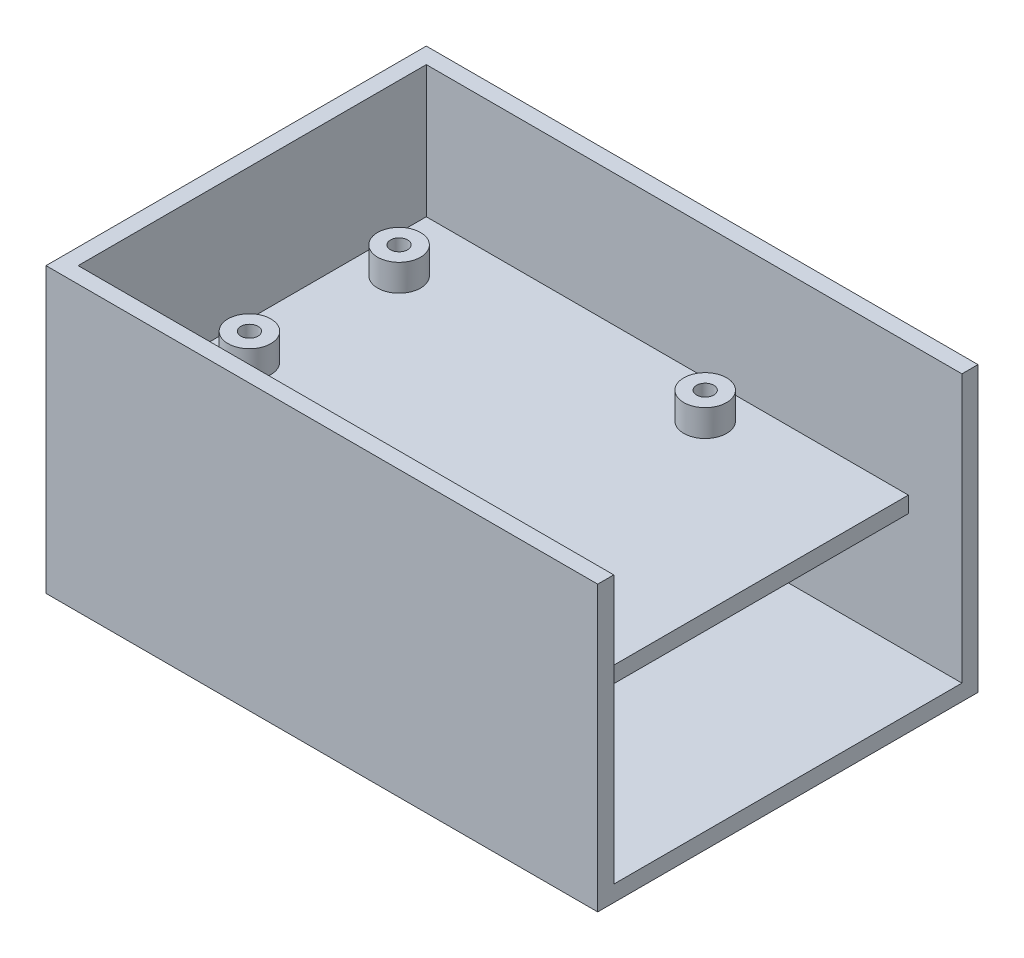
ISO-10303-21;
HEADER;
FILE_DESCRIPTION(('STEP AP214'),'2;1');
FILE_NAME('part.step','',(''),(''),'','','');
FILE_SCHEMA(('AUTOMOTIVE_DESIGN { 1 0 10303 214 1 1 1 1 }'));
ENDSEC;
DATA;
#1=APPLICATION_CONTEXT('core data for automotive mechanical design processes');
#2=APPLICATION_PROTOCOL_DEFINITION('international standard','automotive_design',2000,#1);
#3=PRODUCT_CONTEXT('',#1,'mechanical');
#4=PRODUCT('Part','Part','',(#3));
#5=PRODUCT_RELATED_PRODUCT_CATEGORY('part','',(#4));
#6=PRODUCT_DEFINITION_FORMATION('','',#4);
#7=PRODUCT_DEFINITION_CONTEXT('part definition',#1,'design');
#8=PRODUCT_DEFINITION('design','',#6,#7);
#9=PRODUCT_DEFINITION_SHAPE('','',#8);
#10=(LENGTH_UNIT() NAMED_UNIT(*) SI_UNIT(.MILLI.,.METRE.));
#11=(NAMED_UNIT(*) PLANE_ANGLE_UNIT() SI_UNIT($,.RADIAN.));
#12=(NAMED_UNIT(*) SI_UNIT($,.STERADIAN.) SOLID_ANGLE_UNIT());
#13=UNCERTAINTY_MEASURE_WITH_UNIT(LENGTH_MEASURE(1.E-05),#10,'distance_accuracy_value','');
#14=(GEOMETRIC_REPRESENTATION_CONTEXT(3) GLOBAL_UNCERTAINTY_ASSIGNED_CONTEXT((#13)) GLOBAL_UNIT_ASSIGNED_CONTEXT((#10,
#11,#12)) REPRESENTATION_CONTEXT('',''));
#15=CARTESIAN_POINT('',(0.,0.,0.));
#16=DIRECTION('',(0.,0.,1.));
#17=DIRECTION('',(1.,0.,0.));
#18=AXIS2_PLACEMENT_3D('',#15,#16,#17);
#19=CARTESIAN_POINT('',(-50.,50.,-32.5));
#20=DIRECTION('',(0.,0.,1.));
#21=DIRECTION('',(1.,0.,0.));
#22=AXIS2_PLACEMENT_3D('',#19,#20,#21);
#23=PLANE('',#22);
#24=DIRECTION('',(0.,-1.,0.));
#25=VECTOR('',#24,1.);
#26=CARTESIAN_POINT('',(-50.,50.,-32.5));
#27=LINE('',#26,#25);
#28=CARTESIAN_POINT('',(-50.,50.,-32.5));
#29=VERTEX_POINT('',#28);
#30=CARTESIAN_POINT('',(-50.,25.4,-32.5));
#31=VERTEX_POINT('',#30);
#32=EDGE_CURVE('E137',#29,#31,#27,.T.);
#33=ORIENTED_EDGE('',*,*,#32,.T.);
#34=DIRECTION('',(-1.,0.,0.));
#35=VECTOR('',#34,1.);
#36=CARTESIAN_POINT('',(115.06919393999,25.4,-32.5));
#37=LINE('',#36,#35);
#38=CARTESIAN_POINT('',(40.,25.4,-32.5));
#39=VERTEX_POINT('',#38);
#40=EDGE_CURVE('E131',#39,#31,#37,.T.);
#41=ORIENTED_EDGE('',*,*,#40,.F.);
#42=DIRECTION('',(0.,1.,0.));
#43=VECTOR('',#42,1.);
#44=CARTESIAN_POINT('',(40.,-3.001,-32.5));
#45=LINE('',#44,#43);
#46=CARTESIAN_POINT('',(40.,22.4,-32.5));
#47=VERTEX_POINT('',#46);
#48=EDGE_CURVE('E120',#47,#39,#45,.T.);
#49=ORIENTED_EDGE('',*,*,#48,.F.);
#50=DIRECTION('',(-1.,0.,0.));
#51=VECTOR('',#50,1.);
#52=CARTESIAN_POINT('',(115.06919393999,22.4,-32.5));
#53=LINE('',#52,#51);
#54=CARTESIAN_POINT('',(-50.,22.4,-32.5));
#55=VERTEX_POINT('',#54);
#56=EDGE_CURVE('E56',#47,#55,#53,.T.);
#57=ORIENTED_EDGE('',*,*,#56,.T.);
#58=CARTESIAN_POINT('',(-50.,0.,-32.5));
#59=VERTEX_POINT('',#58);
#60=EDGE_CURVE('E168',#55,#59,#27,.T.);
#61=ORIENTED_EDGE('',*,*,#60,.T.);
#62=DIRECTION('',(-1.,0.,0.));
#63=VECTOR('',#62,1.);
#64=CARTESIAN_POINT('',(-50.,0.,-32.5));
#65=LINE('',#64,#63);
#66=CARTESIAN_POINT('',(50.,0.,-32.5));
#67=VERTEX_POINT('',#66);
#68=EDGE_CURVE('E141',#67,#59,#65,.T.);
#69=ORIENTED_EDGE('',*,*,#68,.F.);
#70=DIRECTION('',(0.,-1.,0.));
#71=VECTOR('',#70,1.);
#72=CARTESIAN_POINT('',(50.,50.,-32.5));
#73=LINE('',#72,#71);
#74=CARTESIAN_POINT('',(50.,50.,-32.5));
#75=VERTEX_POINT('',#74);
#76=EDGE_CURVE('E170',#75,#67,#73,.T.);
#77=ORIENTED_EDGE('',*,*,#76,.F.);
#78=DIRECTION('',(-1.,0.,0.));
#79=VECTOR('',#78,1.);
#80=CARTESIAN_POINT('',(-50.,50.,-32.5));
#81=LINE('',#80,#79);
#82=EDGE_CURVE('E147',#75,#29,#81,.T.);
#83=ORIENTED_EDGE('',*,*,#82,.T.);
#84=EDGE_LOOP('',(#33,#41,#49,#57,#61,#69,#77,#83));
#85=FACE_BOUND('',#84,.T.);
#86=ADVANCED_FACE('F33',(#85),#23,.T.);
#87=CARTESIAN_POINT('',(-50.,50.,-32.5));
#88=DIRECTION('',(1.,0.,0.));
#89=DIRECTION('',(0.,0.,-1.));
#90=AXIS2_PLACEMENT_3D('',#87,#88,#89);
#91=PLANE('',#90);
#92=ORIENTED_EDGE('',*,*,#60,.F.);
#93=DIRECTION('',(0.,0.,-1.));
#94=VECTOR('',#93,1.);
#95=CARTESIAN_POINT('',(-50.,22.4,32.5));
#96=LINE('',#95,#94);
#97=CARTESIAN_POINT('',(-50.,22.4,32.5));
#98=VERTEX_POINT('',#97);
#99=EDGE_CURVE('E292',#98,#55,#96,.T.);
#100=ORIENTED_EDGE('',*,*,#99,.F.);
#101=DIRECTION('',(0.,-1.,0.));
#102=VECTOR('',#101,1.);
#103=CARTESIAN_POINT('',(-50.,50.,32.5));
#104=LINE('',#103,#102);
#105=CARTESIAN_POINT('',(-50.,0.,32.5));
#106=VERTEX_POINT('',#105);
#107=EDGE_CURVE('E164',#98,#106,#104,.T.);
#108=ORIENTED_EDGE('',*,*,#107,.T.);
#109=DIRECTION('',(0.,0.,1.));
#110=VECTOR('',#109,1.);
#111=CARTESIAN_POINT('',(-50.,0.,-32.5));
#112=LINE('',#111,#110);
#113=EDGE_CURVE('E158',#59,#106,#112,.T.);
#114=ORIENTED_EDGE('',*,*,#113,.F.);
#115=EDGE_LOOP('',(#92,#100,#108,#114));
#116=FACE_BOUND('',#115,.T.);
#117=ADVANCED_FACE('F241',(#116),#91,.T.);
#118=CARTESIAN_POINT('',(-50.,50.,32.5));
#119=VERTEX_POINT('',#118);
#120=CARTESIAN_POINT('',(-50.,25.4,32.5));
#121=VERTEX_POINT('',#120);
#122=EDGE_CURVE('E165',#119,#121,#104,.T.);
#123=ORIENTED_EDGE('',*,*,#122,.T.);
#124=DIRECTION('',(0.,0.,1.));
#125=VECTOR('',#124,1.);
#126=CARTESIAN_POINT('',(-50.,25.4,32.5));
#127=LINE('',#126,#125);
#128=EDGE_CURVE('E291',#31,#121,#127,.T.);
#129=ORIENTED_EDGE('',*,*,#128,.F.);
#130=ORIENTED_EDGE('',*,*,#32,.F.);
#131=DIRECTION('',(0.,0.,1.));
#132=VECTOR('',#131,1.);
#133=CARTESIAN_POINT('',(-50.,50.,-32.5));
#134=LINE('',#133,#132);
#135=EDGE_CURVE('E149',#29,#119,#134,.T.);
#136=ORIENTED_EDGE('',*,*,#135,.T.);
#137=EDGE_LOOP('',(#123,#129,#130,#136));
#138=FACE_BOUND('',#137,.T.);
#139=ADVANCED_FACE('F246',(#138),#91,.T.);
#140=CARTESIAN_POINT('',(-50.,50.,32.5));
#141=DIRECTION('',(0.,0.,-1.));
#142=DIRECTION('',(-1.,0.,0.));
#143=AXIS2_PLACEMENT_3D('',#140,#141,#142);
#144=PLANE('',#143);
#145=DIRECTION('',(0.,-1.,0.));
#146=VECTOR('',#145,1.);
#147=CARTESIAN_POINT('',(50.,50.,32.5));
#148=LINE('',#147,#146);
#149=CARTESIAN_POINT('',(50.,50.,32.5));
#150=VERTEX_POINT('',#149);
#151=CARTESIAN_POINT('',(50.,0.,32.5));
#152=VERTEX_POINT('',#151);
#153=EDGE_CURVE('E154',#150,#152,#148,.T.);
#154=ORIENTED_EDGE('',*,*,#153,.T.);
#155=DIRECTION('',(1.,0.,0.));
#156=VECTOR('',#155,1.);
#157=CARTESIAN_POINT('',(-50.,0.,32.5));
#158=LINE('',#157,#156);
#159=EDGE_CURVE('E150',#106,#152,#158,.T.);
#160=ORIENTED_EDGE('',*,*,#159,.F.);
#161=ORIENTED_EDGE('',*,*,#107,.F.);
#162=DIRECTION('',(-1.,0.,0.));
#163=VECTOR('',#162,1.);
#164=CARTESIAN_POINT('',(115.06919393999,22.4,32.5));
#165=LINE('',#164,#163);
#166=CARTESIAN_POINT('',(40.,22.4,32.5));
#167=VERTEX_POINT('',#166);
#168=EDGE_CURVE('E143',#167,#98,#165,.T.);
#169=ORIENTED_EDGE('',*,*,#168,.F.);
#170=DIRECTION('',(0.,1.,0.));
#171=VECTOR('',#170,1.);
#172=CARTESIAN_POINT('',(40.,-3.001,32.5));
#173=LINE('',#172,#171);
#174=CARTESIAN_POINT('',(40.,25.4,32.5));
#175=VERTEX_POINT('',#174);
#176=EDGE_CURVE('E125',#167,#175,#173,.T.);
#177=ORIENTED_EDGE('',*,*,#176,.T.);
#178=DIRECTION('',(-1.,0.,0.));
#179=VECTOR('',#178,1.);
#180=CARTESIAN_POINT('',(115.06919393999,25.4,32.5));
#181=LINE('',#180,#179);
#182=EDGE_CURVE('E133',#175,#121,#181,.T.);
#183=ORIENTED_EDGE('',*,*,#182,.T.);
#184=ORIENTED_EDGE('',*,*,#122,.F.);
#185=DIRECTION('',(1.,0.,0.));
#186=VECTOR('',#185,1.);
#187=CARTESIAN_POINT('',(-50.,50.,32.5));
#188=LINE('',#187,#186);
#189=EDGE_CURVE('E153',#119,#150,#188,.T.);
#190=ORIENTED_EDGE('',*,*,#189,.T.);
#191=EDGE_LOOP('',(#154,#160,#161,#169,#177,#183,#184,#190));
#192=FACE_BOUND('',#191,.T.);
#193=ADVANCED_FACE('F260',(#192),#144,.T.);
#194=CARTESIAN_POINT('',(50.,50.,-32.5));
#195=DIRECTION('',(-1.,0.,0.));
#196=DIRECTION('',(0.,0.,1.));
#197=AXIS2_PLACEMENT_3D('',#194,#195,#196);
#198=PLANE('',#197);
#199=ORIENTED_EDGE('',*,*,#76,.T.);
#200=DIRECTION('',(0.,0.,-1.));
#201=VECTOR('',#200,1.);
#202=CARTESIAN_POINT('',(50.,0.,-32.5));
#203=LINE('',#202,#201);
#204=EDGE_CURVE('E138',#152,#67,#203,.T.);
#205=ORIENTED_EDGE('',*,*,#204,.F.);
#206=ORIENTED_EDGE('',*,*,#153,.F.);
#207=DIRECTION('',(0.,0.,-1.));
#208=VECTOR('',#207,1.);
#209=CARTESIAN_POINT('',(50.,50.,-32.5));
#210=LINE('',#209,#208);
#211=CARTESIAN_POINT('',(50.,50.,35.5));
#212=VERTEX_POINT('',#211);
#213=EDGE_CURVE('E173',#212,#150,#210,.T.);
#214=ORIENTED_EDGE('',*,*,#213,.F.);
#215=DIRECTION('',(0.,-1.,0.));
#216=VECTOR('',#215,1.);
#217=CARTESIAN_POINT('',(50.,50.,35.5));
#218=LINE('',#217,#216);
#219=CARTESIAN_POINT('',(50.,-3.,35.5));
#220=VERTEX_POINT('',#219);
#221=EDGE_CURVE('E190',#212,#220,#218,.T.);
#222=ORIENTED_EDGE('',*,*,#221,.T.);
#223=DIRECTION('',(0.,0.,-1.));
#224=VECTOR('',#223,1.);
#225=CARTESIAN_POINT('',(50.,-3.,-32.5));
#226=LINE('',#225,#224);
#227=CARTESIAN_POINT('',(50.,-3.,-35.5));
#228=VERTEX_POINT('',#227);
#229=EDGE_CURVE('E172',#220,#228,#226,.T.);
#230=ORIENTED_EDGE('',*,*,#229,.T.);
#231=DIRECTION('',(0.,-1.,0.));
#232=VECTOR('',#231,1.);
#233=CARTESIAN_POINT('',(50.,50.,-35.5));
#234=LINE('',#233,#232);
#235=CARTESIAN_POINT('',(50.,50.,-35.5));
#236=VERTEX_POINT('',#235);
#237=EDGE_CURVE('E184',#236,#228,#234,.T.);
#238=ORIENTED_EDGE('',*,*,#237,.F.);
#239=EDGE_CURVE('E177',#75,#236,#210,.T.);
#240=ORIENTED_EDGE('',*,*,#239,.F.);
#241=EDGE_LOOP('',(#199,#205,#206,#214,#222,#230,#238,#240));
#242=FACE_BOUND('',#241,.T.);
#243=ADVANCED_FACE('F256',(#242),#198,.F.);
#244=CARTESIAN_POINT('',(-50.,50.,-35.5));
#245=DIRECTION('',(0.,0.,1.));
#246=DIRECTION('',(1.,0.,0.));
#247=AXIS2_PLACEMENT_3D('',#244,#245,#246);
#248=PLANE('',#247);
#249=DIRECTION('',(-1.,0.,0.));
#250=VECTOR('',#249,1.);
#251=CARTESIAN_POINT('',(-50.,-3.,-35.5));
#252=LINE('',#251,#250);
#253=CARTESIAN_POINT('',(-53.,-3.,-35.5));
#254=VERTEX_POINT('',#253);
#255=EDGE_CURVE('E178',#228,#254,#252,.T.);
#256=ORIENTED_EDGE('',*,*,#255,.T.);
#257=DIRECTION('',(0.,-1.,0.));
#258=VECTOR('',#257,1.);
#259=CARTESIAN_POINT('',(-53.,50.,-35.5));
#260=LINE('',#259,#258);
#261=CARTESIAN_POINT('',(-53.,50.,-35.5));
#262=VERTEX_POINT('',#261);
#263=EDGE_CURVE('E181',#262,#254,#260,.T.);
#264=ORIENTED_EDGE('',*,*,#263,.F.);
#265=DIRECTION('',(-1.,0.,0.));
#266=VECTOR('',#265,1.);
#267=CARTESIAN_POINT('',(-50.,50.,-35.5));
#268=LINE('',#267,#266);
#269=EDGE_CURVE('E176',#236,#262,#268,.T.);
#270=ORIENTED_EDGE('',*,*,#269,.F.);
#271=ORIENTED_EDGE('',*,*,#237,.T.);
#272=EDGE_LOOP('',(#256,#264,#270,#271));
#273=FACE_BOUND('',#272,.T.);
#274=ADVANCED_FACE('F259',(#273),#248,.F.);
#275=CARTESIAN_POINT('',(-53.,50.,-32.5));
#276=DIRECTION('',(1.,0.,0.));
#277=DIRECTION('',(0.,0.,-1.));
#278=AXIS2_PLACEMENT_3D('',#275,#276,#277);
#279=PLANE('',#278);
#280=DIRECTION('',(0.,0.,1.));
#281=VECTOR('',#280,1.);
#282=CARTESIAN_POINT('',(-53.,-3.,-32.5));
#283=LINE('',#282,#281);
#284=CARTESIAN_POINT('',(-53.,-3.,35.5));
#285=VERTEX_POINT('',#284);
#286=EDGE_CURVE('E180',#254,#285,#283,.T.);
#287=ORIENTED_EDGE('',*,*,#286,.T.);
#288=DIRECTION('',(0.,-1.,0.));
#289=VECTOR('',#288,1.);
#290=CARTESIAN_POINT('',(-53.,50.,35.5));
#291=LINE('',#290,#289);
#292=CARTESIAN_POINT('',(-53.,50.,35.5));
#293=VERTEX_POINT('',#292);
#294=EDGE_CURVE('E185',#293,#285,#291,.T.);
#295=ORIENTED_EDGE('',*,*,#294,.F.);
#296=DIRECTION('',(0.,0.,1.));
#297=VECTOR('',#296,1.);
#298=CARTESIAN_POINT('',(-53.,50.,-32.5));
#299=LINE('',#298,#297);
#300=EDGE_CURVE('E193',#262,#293,#299,.T.);
#301=ORIENTED_EDGE('',*,*,#300,.F.);
#302=ORIENTED_EDGE('',*,*,#263,.T.);
#303=EDGE_LOOP('',(#287,#295,#301,#302));
#304=FACE_BOUND('',#303,.T.);
#305=ADVANCED_FACE('F264',(#304),#279,.F.);
#306=CARTESIAN_POINT('',(-50.,50.,35.5));
#307=DIRECTION('',(0.,0.,-1.));
#308=DIRECTION('',(-1.,0.,0.));
#309=AXIS2_PLACEMENT_3D('',#306,#307,#308);
#310=PLANE('',#309);
#311=DIRECTION('',(1.,0.,0.));
#312=VECTOR('',#311,1.);
#313=CARTESIAN_POINT('',(-50.,-3.,35.5));
#314=LINE('',#313,#312);
#315=EDGE_CURVE('E187',#285,#220,#314,.T.);
#316=ORIENTED_EDGE('',*,*,#315,.T.);
#317=ORIENTED_EDGE('',*,*,#221,.F.);
#318=DIRECTION('',(1.,0.,0.));
#319=VECTOR('',#318,1.);
#320=CARTESIAN_POINT('',(-50.,50.,35.5));
#321=LINE('',#320,#319);
#322=EDGE_CURVE('E195',#293,#212,#321,.T.);
#323=ORIENTED_EDGE('',*,*,#322,.F.);
#324=ORIENTED_EDGE('',*,*,#294,.T.);
#325=EDGE_LOOP('',(#316,#317,#323,#324));
#326=FACE_BOUND('',#325,.T.);
#327=ADVANCED_FACE('F254',(#326),#310,.F.);
#328=CARTESIAN_POINT('',(0.,50.,0.));
#329=DIRECTION('',(0.,1.,0.));
#330=DIRECTION('',(0.,0.,1.));
#331=AXIS2_PLACEMENT_3D('',#328,#329,#330);
#332=PLANE('',#331);
#333=ORIENTED_EDGE('',*,*,#82,.F.);
#334=ORIENTED_EDGE('',*,*,#239,.T.);
#335=ORIENTED_EDGE('',*,*,#269,.T.);
#336=ORIENTED_EDGE('',*,*,#300,.T.);
#337=ORIENTED_EDGE('',*,*,#322,.T.);
#338=ORIENTED_EDGE('',*,*,#213,.T.);
#339=ORIENTED_EDGE('',*,*,#189,.F.);
#340=ORIENTED_EDGE('',*,*,#135,.F.);
#341=EDGE_LOOP('',(#333,#334,#335,#336,#337,#338,#339,#340));
#342=FACE_BOUND('',#341,.T.);
#343=ADVANCED_FACE('F251',(#342),#332,.T.);
#344=CARTESIAN_POINT('',(0.,-3.,0.));
#345=DIRECTION('',(0.,1.,0.));
#346=DIRECTION('',(0.,0.,1.));
#347=AXIS2_PLACEMENT_3D('',#344,#345,#346);
#348=PLANE('',#347);
#349=ORIENTED_EDGE('',*,*,#229,.F.);
#350=ORIENTED_EDGE('',*,*,#315,.F.);
#351=ORIENTED_EDGE('',*,*,#286,.F.);
#352=ORIENTED_EDGE('',*,*,#255,.F.);
#353=EDGE_LOOP('',(#349,#350,#351,#352));
#354=FACE_BOUND('',#353,.T.);
#355=ADVANCED_FACE('F35',(#354),#348,.F.);
#356=CARTESIAN_POINT('',(0.,0.,0.));
#357=DIRECTION('',(0.,1.,0.));
#358=DIRECTION('',(0.,0.,1.));
#359=AXIS2_PLACEMENT_3D('',#356,#357,#358);
#360=PLANE('',#359);
#361=ORIENTED_EDGE('',*,*,#204,.T.);
#362=ORIENTED_EDGE('',*,*,#68,.T.);
#363=ORIENTED_EDGE('',*,*,#113,.T.);
#364=ORIENTED_EDGE('',*,*,#159,.T.);
#365=EDGE_LOOP('',(#361,#362,#363,#364));
#366=FACE_BOUND('',#365,.T.);
#367=ADVANCED_FACE('F306',(#366),#360,.T.);
#368=CARTESIAN_POINT('',(115.06919393999,22.4,32.5));
#369=DIRECTION('',(0.,1.,0.));
#370=DIRECTION('',(0.,0.,1.));
#371=AXIS2_PLACEMENT_3D('',#368,#369,#370);
#372=PLANE('',#371);
#373=ORIENTED_EDGE('',*,*,#56,.F.);
#374=DIRECTION('',(0.,0.,-1.));
#375=VECTOR('',#374,1.);
#376=CARTESIAN_POINT('',(40.,22.4,32.5));
#377=LINE('',#376,#375);
#378=EDGE_CURVE('E123',#167,#47,#377,.T.);
#379=ORIENTED_EDGE('',*,*,#378,.F.);
#380=ORIENTED_EDGE('',*,*,#168,.T.);
#381=ORIENTED_EDGE('',*,*,#99,.T.);
#382=EDGE_LOOP('',(#373,#379,#380,#381));
#383=FACE_BOUND('',#382,.T.);
#384=ADVANCED_FACE('F215',(#383),#372,.F.);
#385=CARTESIAN_POINT('',(115.06919393999,25.4,32.5));
#386=DIRECTION('',(0.,-1.,0.));
#387=DIRECTION('',(0.,0.,-1.));
#388=AXIS2_PLACEMENT_3D('',#385,#386,#387);
#389=PLANE('',#388);
#390=CARTESIAN_POINT('',(-43.,25.4,-20.42));
#391=DIRECTION('',(0.,-1.,0.));
#392=DIRECTION('',(0.,0.,-1.));
#393=AXIS2_PLACEMENT_3D('',#390,#391,#392);
#394=CIRCLE('',#393,4.);
#395=CARTESIAN_POINT('',(-43.,25.4,-24.42));
#396=VERTEX_POINT('',#395);
#397=EDGE_CURVE('E11',#396,#396,#394,.F.);
#398=ORIENTED_EDGE('',*,*,#397,.F.);
#399=EDGE_LOOP('',(#398));
#400=FACE_BOUND('',#399,.T.);
#401=CARTESIAN_POINT('',(-43.,25.4,7.52));
#402=DIRECTION('',(0.,-1.,0.));
#403=DIRECTION('',(0.,0.,-1.));
#404=AXIS2_PLACEMENT_3D('',#401,#402,#403);
#405=CIRCLE('',#404,4.);
#406=CARTESIAN_POINT('',(-43.,25.4,3.52000000000001));
#407=VERTEX_POINT('',#406);
#408=EDGE_CURVE('E41',#407,#407,#405,.F.);
#409=ORIENTED_EDGE('',*,*,#408,.F.);
#410=EDGE_LOOP('',(#409));
#411=FACE_BOUND('',#410,.T.);
#412=CARTESIAN_POINT('',(7.79999999999998,25.4,22.76));
#413=DIRECTION('',(0.,-1.,0.));
#414=DIRECTION('',(0.,0.,-1.));
#415=AXIS2_PLACEMENT_3D('',#412,#413,#414);
#416=CIRCLE('',#415,4.);
#417=CARTESIAN_POINT('',(7.79999999999998,25.4,18.76));
#418=VERTEX_POINT('',#417);
#419=EDGE_CURVE('E206',#418,#418,#416,.F.);
#420=ORIENTED_EDGE('',*,*,#419,.F.);
#421=EDGE_LOOP('',(#420));
#422=FACE_BOUND('',#421,.T.);
#423=CARTESIAN_POINT('',(9.06999999999997,25.4,-25.5));
#424=DIRECTION('',(0.,-1.,0.));
#425=DIRECTION('',(0.,0.,-1.));
#426=AXIS2_PLACEMENT_3D('',#423,#424,#425);
#427=CIRCLE('',#426,4.);
#428=CARTESIAN_POINT('',(9.06999999999997,25.4,-29.5));
#429=VERTEX_POINT('',#428);
#430=EDGE_CURVE('E203',#429,#429,#427,.F.);
#431=ORIENTED_EDGE('',*,*,#430,.F.);
#432=EDGE_LOOP('',(#431));
#433=FACE_BOUND('',#432,.T.);
#434=ORIENTED_EDGE('',*,*,#182,.F.);
#435=DIRECTION('',(0.,0.,1.));
#436=VECTOR('',#435,1.);
#437=CARTESIAN_POINT('',(40.,25.4,32.5));
#438=LINE('',#437,#436);
#439=EDGE_CURVE('E48',#39,#175,#438,.T.);
#440=ORIENTED_EDGE('',*,*,#439,.F.);
#441=ORIENTED_EDGE('',*,*,#40,.T.);
#442=ORIENTED_EDGE('',*,*,#128,.T.);
#443=EDGE_LOOP('',(#434,#440,#441,#442));
#444=FACE_BOUND('',#443,.T.);
#445=ADVANCED_FACE('F129',(#400,#411,#422,#433,#444),#389,.F.);
#446=CARTESIAN_POINT('',(40.,-3.001,32.5));
#447=DIRECTION('',(-1.,0.,0.));
#448=DIRECTION('',(0.,0.,1.));
#449=AXIS2_PLACEMENT_3D('',#446,#447,#448);
#450=PLANE('',#449);
#451=ORIENTED_EDGE('',*,*,#378,.T.);
#452=ORIENTED_EDGE('',*,*,#48,.T.);
#453=ORIENTED_EDGE('',*,*,#439,.T.);
#454=ORIENTED_EDGE('',*,*,#176,.F.);
#455=EDGE_LOOP('',(#451,#452,#453,#454));
#456=FACE_BOUND('',#455,.T.);
#457=ADVANCED_FACE('F121',(#456),#450,.F.);
#458=CARTESIAN_POINT('',(9.06999999999997,30.4,-25.5));
#459=DIRECTION('',(0.,1.,0.));
#460=DIRECTION('',(0.,0.,1.));
#461=AXIS2_PLACEMENT_3D('',#458,#459,#460);
#462=PLANE('',#461);
#463=CARTESIAN_POINT('',(9.06999999999997,30.4,-25.5));
#464=DIRECTION('',(0.,1.,0.));
#465=DIRECTION('',(0.,0.,1.));
#466=AXIS2_PLACEMENT_3D('',#463,#464,#465);
#467=CIRCLE('',#466,4.);
#468=CARTESIAN_POINT('',(9.06999999999997,30.4,-21.5));
#469=VERTEX_POINT('',#468);
#470=EDGE_CURVE('E565',#469,#469,#467,.T.);
#471=ORIENTED_EDGE('',*,*,#470,.T.);
#472=EDGE_LOOP('',(#471));
#473=FACE_BOUND('',#472,.T.);
#474=CARTESIAN_POINT('',(9.06999999999997,30.4,-25.5));
#475=DIRECTION('',(0.,1.,0.));
#476=DIRECTION('',(0.,0.,1.));
#477=AXIS2_PLACEMENT_3D('',#474,#475,#476);
#478=CIRCLE('',#477,1.6);
#479=CARTESIAN_POINT('',(9.06999999999997,30.4,-23.9));
#480=VERTEX_POINT('',#479);
#481=EDGE_CURVE('E562',#480,#480,#478,.T.);
#482=ORIENTED_EDGE('',*,*,#481,.F.);
#483=EDGE_LOOP('',(#482));
#484=FACE_BOUND('',#483,.T.);
#485=ADVANCED_FACE('F227',(#473,#484),#462,.T.);
#486=CARTESIAN_POINT('',(9.06999999999997,30.4,-25.5));
#487=DIRECTION('',(0.,-1.,0.));
#488=DIRECTION('',(0.,0.,-1.));
#489=AXIS2_PLACEMENT_3D('',#486,#487,#488);
#490=CYLINDRICAL_SURFACE('',#489,4.);
#491=ORIENTED_EDGE('',*,*,#470,.F.);
#492=EDGE_LOOP('',(#491));
#493=FACE_BOUND('',#492,.T.);
#494=ORIENTED_EDGE('',*,*,#430,.T.);
#495=EDGE_LOOP('',(#494));
#496=FACE_BOUND('',#495,.T.);
#497=ADVANCED_FACE('F224',(#493,#496),#490,.T.);
#498=CARTESIAN_POINT('',(9.06999999999997,30.4,-25.5));
#499=DIRECTION('',(0.,-1.,0.));
#500=DIRECTION('',(0.,0.,-1.));
#501=AXIS2_PLACEMENT_3D('',#498,#499,#500);
#502=CYLINDRICAL_SURFACE('',#501,1.6);
#503=ORIENTED_EDGE('',*,*,#481,.T.);
#504=EDGE_LOOP('',(#503));
#505=FACE_BOUND('',#504,.T.);
#506=CARTESIAN_POINT('',(9.06999999999997,25.4,-25.5));
#507=DIRECTION('',(0.,1.,0.));
#508=DIRECTION('',(0.,0.,1.));
#509=AXIS2_PLACEMENT_3D('',#506,#507,#508);
#510=CIRCLE('',#509,1.6);
#511=CARTESIAN_POINT('',(9.06999999999997,25.4,-23.9));
#512=VERTEX_POINT('',#511);
#513=EDGE_CURVE('E561',#512,#512,#510,.T.);
#514=ORIENTED_EDGE('',*,*,#513,.F.);
#515=EDGE_LOOP('',(#514));
#516=FACE_BOUND('',#515,.T.);
#517=ADVANCED_FACE('F226',(#505,#516),#502,.F.);
#518=ORIENTED_EDGE('',*,*,#513,.T.);
#519=EDGE_LOOP('',(#518));
#520=FACE_BOUND('',#519,.T.);
#521=ADVANCED_FACE('F219',(#520),#389,.F.);
#522=CARTESIAN_POINT('',(7.79999999999998,30.4,22.76));
#523=DIRECTION('',(0.,1.,0.));
#524=DIRECTION('',(0.,0.,1.));
#525=AXIS2_PLACEMENT_3D('',#522,#523,#524);
#526=PLANE('',#525);
#527=CARTESIAN_POINT('',(7.79999999999998,30.4,22.76));
#528=DIRECTION('',(0.,1.,0.));
#529=DIRECTION('',(0.,0.,1.));
#530=AXIS2_PLACEMENT_3D('',#527,#528,#529);
#531=CIRCLE('',#530,4.);
#532=CARTESIAN_POINT('',(7.79999999999998,30.4,26.76));
#533=VERTEX_POINT('',#532);
#534=EDGE_CURVE('E556',#533,#533,#531,.T.);
#535=ORIENTED_EDGE('',*,*,#534,.T.);
#536=EDGE_LOOP('',(#535));
#537=FACE_BOUND('',#536,.T.);
#538=CARTESIAN_POINT('',(7.79999999999998,30.4,22.76));
#539=DIRECTION('',(0.,1.,0.));
#540=DIRECTION('',(0.,0.,1.));
#541=AXIS2_PLACEMENT_3D('',#538,#539,#540);
#542=CIRCLE('',#541,1.6);
#543=CARTESIAN_POINT('',(7.79999999999998,30.4,24.36));
#544=VERTEX_POINT('',#543);
#545=EDGE_CURVE('E553',#544,#544,#542,.T.);
#546=ORIENTED_EDGE('',*,*,#545,.F.);
#547=EDGE_LOOP('',(#546));
#548=FACE_BOUND('',#547,.T.);
#549=ADVANCED_FACE('F415',(#537,#548),#526,.T.);
#550=CARTESIAN_POINT('',(7.79999999999998,30.4,22.76));
#551=DIRECTION('',(0.,-1.,0.));
#552=DIRECTION('',(0.,0.,-1.));
#553=AXIS2_PLACEMENT_3D('',#550,#551,#552);
#554=CYLINDRICAL_SURFACE('',#553,4.);
#555=ORIENTED_EDGE('',*,*,#534,.F.);
#556=EDGE_LOOP('',(#555));
#557=FACE_BOUND('',#556,.T.);
#558=ORIENTED_EDGE('',*,*,#419,.T.);
#559=EDGE_LOOP('',(#558));
#560=FACE_BOUND('',#559,.T.);
#561=ADVANCED_FACE('F425',(#557,#560),#554,.T.);
#562=CARTESIAN_POINT('',(7.79999999999998,30.4,22.76));
#563=DIRECTION('',(0.,-1.,0.));
#564=DIRECTION('',(0.,0.,-1.));
#565=AXIS2_PLACEMENT_3D('',#562,#563,#564);
#566=CYLINDRICAL_SURFACE('',#565,1.6);
#567=ORIENTED_EDGE('',*,*,#545,.T.);
#568=EDGE_LOOP('',(#567));
#569=FACE_BOUND('',#568,.T.);
#570=CARTESIAN_POINT('',(7.79999999999998,25.4,22.76));
#571=DIRECTION('',(0.,1.,0.));
#572=DIRECTION('',(0.,0.,1.));
#573=AXIS2_PLACEMENT_3D('',#570,#571,#572);
#574=CIRCLE('',#573,1.6);
#575=CARTESIAN_POINT('',(7.79999999999998,25.4,24.36));
#576=VERTEX_POINT('',#575);
#577=EDGE_CURVE('E552',#576,#576,#574,.T.);
#578=ORIENTED_EDGE('',*,*,#577,.F.);
#579=EDGE_LOOP('',(#578));
#580=FACE_BOUND('',#579,.T.);
#581=ADVANCED_FACE('F435',(#569,#580),#566,.F.);
#582=ORIENTED_EDGE('',*,*,#577,.T.);
#583=EDGE_LOOP('',(#582));
#584=FACE_BOUND('',#583,.T.);
#585=ADVANCED_FACE('F417',(#584),#389,.F.);
#586=CARTESIAN_POINT('',(-43.,30.4,7.52));
#587=DIRECTION('',(0.,1.,0.));
#588=DIRECTION('',(0.,0.,1.));
#589=AXIS2_PLACEMENT_3D('',#586,#587,#588);
#590=PLANE('',#589);
#591=CARTESIAN_POINT('',(-43.,30.4,7.52));
#592=DIRECTION('',(0.,1.,0.));
#593=DIRECTION('',(0.,0.,1.));
#594=AXIS2_PLACEMENT_3D('',#591,#592,#593);
#595=CIRCLE('',#594,4.);
#596=CARTESIAN_POINT('',(-43.,30.4,11.52));
#597=VERTEX_POINT('',#596);
#598=EDGE_CURVE('E547',#597,#597,#595,.T.);
#599=ORIENTED_EDGE('',*,*,#598,.T.);
#600=EDGE_LOOP('',(#599));
#601=FACE_BOUND('',#600,.T.);
#602=CARTESIAN_POINT('',(-43.,30.4,7.52));
#603=DIRECTION('',(0.,1.,0.));
#604=DIRECTION('',(0.,0.,1.));
#605=AXIS2_PLACEMENT_3D('',#602,#603,#604);
#606=CIRCLE('',#605,1.60000000000001);
#607=CARTESIAN_POINT('',(-43.,30.4,9.12000000000001));
#608=VERTEX_POINT('',#607);
#609=EDGE_CURVE('E544',#608,#608,#606,.T.);
#610=ORIENTED_EDGE('',*,*,#609,.F.);
#611=EDGE_LOOP('',(#610));
#612=FACE_BOUND('',#611,.T.);
#613=ADVANCED_FACE('F454',(#601,#612),#590,.T.);
#614=CARTESIAN_POINT('',(-43.,30.4,7.52));
#615=DIRECTION('',(0.,-1.,0.));
#616=DIRECTION('',(0.,0.,-1.));
#617=AXIS2_PLACEMENT_3D('',#614,#615,#616);
#618=CYLINDRICAL_SURFACE('',#617,4.);
#619=ORIENTED_EDGE('',*,*,#598,.F.);
#620=EDGE_LOOP('',(#619));
#621=FACE_BOUND('',#620,.T.);
#622=ORIENTED_EDGE('',*,*,#408,.T.);
#623=EDGE_LOOP('',(#622));
#624=FACE_BOUND('',#623,.T.);
#625=ADVANCED_FACE('F211',(#621,#624),#618,.T.);
#626=CARTESIAN_POINT('',(-43.,30.4,7.52));
#627=DIRECTION('',(0.,-1.,0.));
#628=DIRECTION('',(0.,0.,-1.));
#629=AXIS2_PLACEMENT_3D('',#626,#627,#628);
#630=CYLINDRICAL_SURFACE('',#629,1.60000000000001);
#631=ORIENTED_EDGE('',*,*,#609,.T.);
#632=EDGE_LOOP('',(#631));
#633=FACE_BOUND('',#632,.T.);
#634=CARTESIAN_POINT('',(-43.,25.4,7.52));
#635=DIRECTION('',(0.,1.,0.));
#636=DIRECTION('',(0.,0.,1.));
#637=AXIS2_PLACEMENT_3D('',#634,#635,#636);
#638=CIRCLE('',#637,1.60000000000001);
#639=CARTESIAN_POINT('',(-43.,25.4,9.12000000000001));
#640=VERTEX_POINT('',#639);
#641=EDGE_CURVE('E543',#640,#640,#638,.T.);
#642=ORIENTED_EDGE('',*,*,#641,.F.);
#643=EDGE_LOOP('',(#642));
#644=FACE_BOUND('',#643,.T.);
#645=ADVANCED_FACE('F473',(#633,#644),#630,.F.);
#646=ORIENTED_EDGE('',*,*,#641,.T.);
#647=EDGE_LOOP('',(#646));
#648=FACE_BOUND('',#647,.T.);
#649=ADVANCED_FACE('F456',(#648),#389,.F.);
#650=CARTESIAN_POINT('',(-43.,30.4,-20.42));
#651=DIRECTION('',(0.,1.,0.));
#652=DIRECTION('',(0.,0.,1.));
#653=AXIS2_PLACEMENT_3D('',#650,#651,#652);
#654=PLANE('',#653);
#655=CARTESIAN_POINT('',(-43.,30.4,-20.42));
#656=DIRECTION('',(0.,1.,0.));
#657=DIRECTION('',(0.,0.,1.));
#658=AXIS2_PLACEMENT_3D('',#655,#656,#657);
#659=CIRCLE('',#658,4.);
#660=CARTESIAN_POINT('',(-43.,30.4,-16.42));
#661=VERTEX_POINT('',#660);
#662=EDGE_CURVE('E538',#661,#661,#659,.T.);
#663=ORIENTED_EDGE('',*,*,#662,.T.);
#664=EDGE_LOOP('',(#663));
#665=FACE_BOUND('',#664,.T.);
#666=CARTESIAN_POINT('',(-43.,30.4,-20.42));
#667=DIRECTION('',(0.,1.,0.));
#668=DIRECTION('',(0.,0.,1.));
#669=AXIS2_PLACEMENT_3D('',#666,#667,#668);
#670=CIRCLE('',#669,1.6);
#671=CARTESIAN_POINT('',(-43.,30.4,-18.82));
#672=VERTEX_POINT('',#671);
#673=EDGE_CURVE('E535',#672,#672,#670,.T.);
#674=ORIENTED_EDGE('',*,*,#673,.F.);
#675=EDGE_LOOP('',(#674));
#676=FACE_BOUND('',#675,.T.);
#677=ADVANCED_FACE('F492',(#665,#676),#654,.T.);
#678=CARTESIAN_POINT('',(-43.,30.4,-20.42));
#679=DIRECTION('',(0.,-1.,0.));
#680=DIRECTION('',(0.,0.,-1.));
#681=AXIS2_PLACEMENT_3D('',#678,#679,#680);
#682=CYLINDRICAL_SURFACE('',#681,4.);
#683=ORIENTED_EDGE('',*,*,#662,.F.);
#684=EDGE_LOOP('',(#683));
#685=FACE_BOUND('',#684,.T.);
#686=ORIENTED_EDGE('',*,*,#397,.T.);
#687=EDGE_LOOP('',(#686));
#688=FACE_BOUND('',#687,.T.);
#689=ADVANCED_FACE('F500',(#685,#688),#682,.T.);
#690=CARTESIAN_POINT('',(-43.,30.4,-20.42));
#691=DIRECTION('',(0.,-1.,0.));
#692=DIRECTION('',(0.,0.,-1.));
#693=AXIS2_PLACEMENT_3D('',#690,#691,#692);
#694=CYLINDRICAL_SURFACE('',#693,1.6);
#695=ORIENTED_EDGE('',*,*,#673,.T.);
#696=EDGE_LOOP('',(#695));
#697=FACE_BOUND('',#696,.T.);
#698=CARTESIAN_POINT('',(-43.,25.4,-20.42));
#699=DIRECTION('',(0.,1.,0.));
#700=DIRECTION('',(0.,0.,1.));
#701=AXIS2_PLACEMENT_3D('',#698,#699,#700);
#702=CIRCLE('',#701,1.6);
#703=CARTESIAN_POINT('',(-43.,25.4,-18.82));
#704=VERTEX_POINT('',#703);
#705=EDGE_CURVE('E533',#704,#704,#702,.T.);
#706=ORIENTED_EDGE('',*,*,#705,.F.);
#707=EDGE_LOOP('',(#706));
#708=FACE_BOUND('',#707,.T.);
#709=ADVANCED_FACE('F510',(#697,#708),#694,.F.);
#710=ORIENTED_EDGE('',*,*,#705,.T.);
#711=EDGE_LOOP('',(#710));
#712=FACE_BOUND('',#711,.T.);
#713=ADVANCED_FACE('F218',(#712),#389,.F.);
#714=CLOSED_SHELL('',(#86,#117,#139,#193,#243,#274,#305,#327,#343,#355,#367,#384,#445,#457,#485,
#497,#517,#521,#549,#561,#581,#585,#613,#625,#645,#649,#677,#689,#709,#713));
#715=MANIFOLD_SOLID_BREP('B2',#714);
#716=ADVANCED_BREP_SHAPE_REPRESENTATION('',(#18,#715),#14);
#717=SHAPE_DEFINITION_REPRESENTATION(#9,#716);
ENDSEC;
END-ISO-10303-21;
